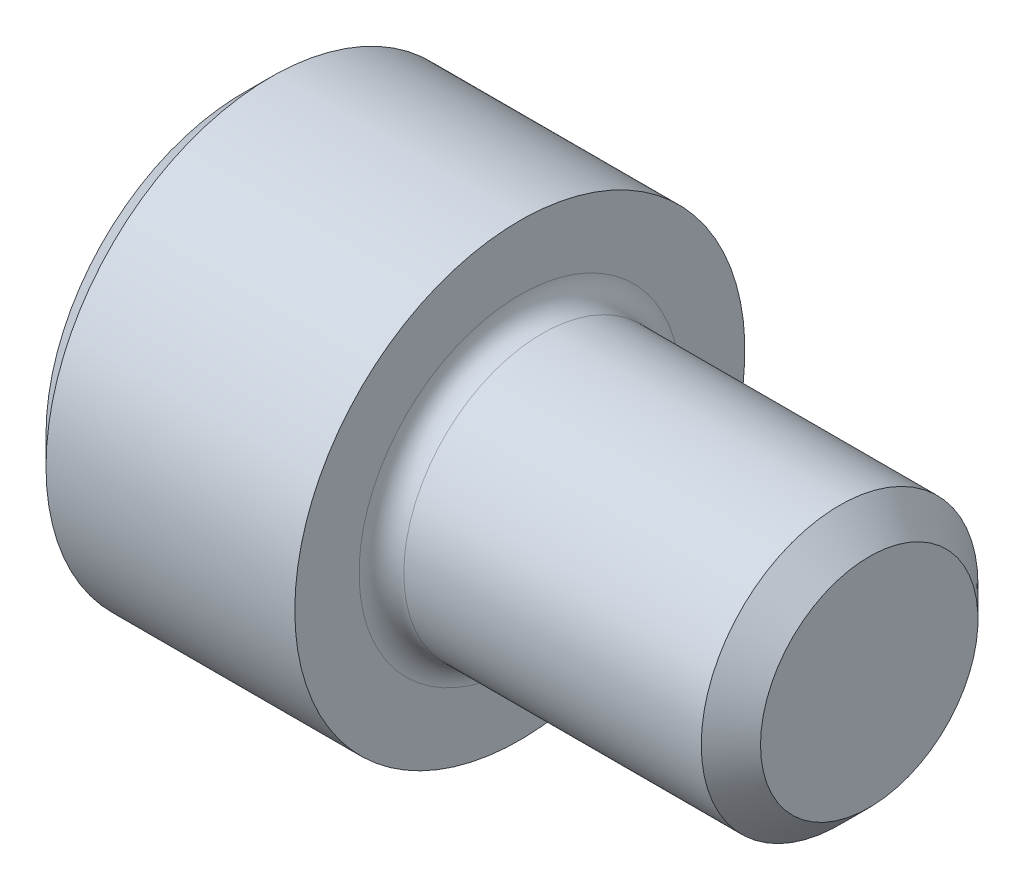
ISO-10303-21;
HEADER;
FILE_DESCRIPTION(('STEP AP214'),'2;1');
FILE_NAME('part.step','',(''),(''),'','','');
FILE_SCHEMA(('AUTOMOTIVE_DESIGN { 1 0 10303 214 1 1 1 1 }'));
ENDSEC;
DATA;
#1=APPLICATION_CONTEXT('core data for automotive mechanical design processes');
#2=APPLICATION_PROTOCOL_DEFINITION('international standard','automotive_design',2000,#1);
#3=PRODUCT_CONTEXT('',#1,'mechanical');
#4=PRODUCT('Part','Part','',(#3));
#5=PRODUCT_RELATED_PRODUCT_CATEGORY('part','',(#4));
#6=PRODUCT_DEFINITION_FORMATION('','',#4);
#7=PRODUCT_DEFINITION_CONTEXT('part definition',#1,'design');
#8=PRODUCT_DEFINITION('design','',#6,#7);
#9=PRODUCT_DEFINITION_SHAPE('','',#8);
#10=(LENGTH_UNIT() NAMED_UNIT(*) SI_UNIT(.MILLI.,.METRE.));
#11=(NAMED_UNIT(*) PLANE_ANGLE_UNIT() SI_UNIT($,.RADIAN.));
#12=(NAMED_UNIT(*) SI_UNIT($,.STERADIAN.) SOLID_ANGLE_UNIT());
#13=UNCERTAINTY_MEASURE_WITH_UNIT(LENGTH_MEASURE(1.E-05),#10,'distance_accuracy_value','');
#14=(GEOMETRIC_REPRESENTATION_CONTEXT(3) GLOBAL_UNCERTAINTY_ASSIGNED_CONTEXT((#13)) GLOBAL_UNIT_ASSIGNED_CONTEXT((#10,
#11,#12)) REPRESENTATION_CONTEXT('',''));
#15=CARTESIAN_POINT('',(0.,0.,0.));
#16=DIRECTION('',(0.,0.,1.));
#17=DIRECTION('',(1.,0.,0.));
#18=AXIS2_PLACEMENT_3D('',#15,#16,#17);
#19=CARTESIAN_POINT('',(0.,0.,0.));
#20=DIRECTION('',(-1.,0.,0.));
#21=DIRECTION('',(0.,0.,1.));
#22=AXIS2_PLACEMENT_3D('',#19,#20,#21);
#23=PLANE('',#22);
#24=DIRECTION('',(0.,-0.499999999999999,0.866025403784439));
#25=VECTOR('',#24,1.);
#26=CARTESIAN_POINT('',(0.,1.14384635331849,0.));
#27=LINE('',#26,#25);
#28=CARTESIAN_POINT('',(0.,1.14384635331849,0.));
#29=VERTEX_POINT('',#28);
#30=CARTESIAN_POINT('',(0.,0.571923176659249,0.990599999999998));
#31=VERTEX_POINT('',#30);
#32=EDGE_CURVE('E258',#29,#31,#27,.T.);
#33=ORIENTED_EDGE('',*,*,#32,.T.);
#34=DIRECTION('',(0.,1.,0.));
#35=VECTOR('',#34,1.);
#36=CARTESIAN_POINT('',(0.,-0.571923176659238,0.9906));
#37=LINE('',#36,#35);
#38=CARTESIAN_POINT('',(0.,-0.571923176659238,0.9906));
#39=VERTEX_POINT('',#38);
#40=EDGE_CURVE('E129',#39,#31,#37,.T.);
#41=ORIENTED_EDGE('',*,*,#40,.F.);
#42=DIRECTION('',(0.,-0.500000000000001,-0.866025403784438));
#43=VECTOR('',#42,1.);
#44=CARTESIAN_POINT('',(0.,-0.571923176659238,0.9906));
#45=LINE('',#44,#43);
#46=CARTESIAN_POINT('',(0.,-1.14384635331848,0.));
#47=VERTEX_POINT('',#46);
#48=EDGE_CURVE('E261',#39,#47,#45,.T.);
#49=ORIENTED_EDGE('',*,*,#48,.T.);
#50=DIRECTION('',(0.,0.499999999999999,-0.866025403784439));
#51=VECTOR('',#50,1.);
#52=CARTESIAN_POINT('',(0.,-1.14384635331848,0.));
#53=LINE('',#52,#51);
#54=CARTESIAN_POINT('',(0.,-0.57192317665924,-0.990600000000001));
#55=VERTEX_POINT('',#54);
#56=EDGE_CURVE('E264',#47,#55,#53,.T.);
#57=ORIENTED_EDGE('',*,*,#56,.T.);
#58=DIRECTION('',(0.,-1.,0.));
#59=VECTOR('',#58,1.);
#60=CARTESIAN_POINT('',(0.,0.571923176659246,-0.990600000000003));
#61=LINE('',#60,#59);
#62=CARTESIAN_POINT('',(0.,0.571923176659246,-0.990600000000003));
#63=VERTEX_POINT('',#62);
#64=EDGE_CURVE('E267',#63,#55,#61,.T.);
#65=ORIENTED_EDGE('',*,*,#64,.F.);
#66=DIRECTION('',(0.,-0.500000000000001,-0.866025403784438));
#67=VECTOR('',#66,1.);
#68=CARTESIAN_POINT('',(0.,1.14384635331849,0.));
#69=LINE('',#68,#67);
#70=EDGE_CURVE('E124',#29,#63,#69,.T.);
#71=ORIENTED_EDGE('',*,*,#70,.F.);
#72=EDGE_LOOP('',(#33,#41,#49,#57,#65,#71));
#73=FACE_BOUND('',#72,.T.);
#74=CARTESIAN_POINT('',(0.,0.,0.));
#75=DIRECTION('',(-1.,0.,0.));
#76=DIRECTION('',(0.,0.,1.));
#77=AXIS2_PLACEMENT_3D('',#74,#75,#76);
#78=CIRCLE('',#77,1.7907);
#79=CARTESIAN_POINT('',(0.,0.,1.7907));
#80=VERTEX_POINT('',#79);
#81=EDGE_CURVE('E153',#80,#80,#78,.T.);
#82=ORIENTED_EDGE('',*,*,#81,.T.);
#83=EDGE_LOOP('',(#82));
#84=FACE_BOUND('',#83,.T.);
#85=ADVANCED_FACE('F33',(#73,#84),#23,.T.);
#86=CARTESIAN_POINT('',(0.,0.,0.));
#87=DIRECTION('',(1.,0.,0.));
#88=DIRECTION('',(0.,0.,-1.));
#89=AXIS2_PLACEMENT_3D('',#86,#87,#88);
#90=CONICAL_SURFACE('',#89,1.7907,0.785398163397442);
#91=CARTESIAN_POINT('',(0.254000000000004,0.,0.));
#92=DIRECTION('',(-1.,0.,0.));
#93=DIRECTION('',(0.,0.,1.));
#94=AXIS2_PLACEMENT_3D('',#91,#92,#93);
#95=CIRCLE('',#94,2.0447);
#96=CARTESIAN_POINT('',(0.254000000000004,0.,2.0447));
#97=VERTEX_POINT('',#96);
#98=EDGE_CURVE('E150',#97,#97,#95,.T.);
#99=ORIENTED_EDGE('',*,*,#98,.T.);
#100=EDGE_LOOP('',(#99));
#101=FACE_BOUND('',#100,.T.);
#102=ORIENTED_EDGE('',*,*,#81,.F.);
#103=EDGE_LOOP('',(#102));
#104=FACE_BOUND('',#103,.T.);
#105=ADVANCED_FACE('F174',(#101,#104),#90,.T.);
#106=CARTESIAN_POINT('',(-31.75,0.,0.));
#107=DIRECTION('',(-1.,0.,0.));
#108=DIRECTION('',(0.,0.,1.));
#109=AXIS2_PLACEMENT_3D('',#106,#107,#108);
#110=CYLINDRICAL_SURFACE('',#109,2.0447);
#111=CARTESIAN_POINT('',(2.51460000000001,0.,0.));
#112=DIRECTION('',(-1.,0.,0.));
#113=DIRECTION('',(0.,0.,1.));
#114=AXIS2_PLACEMENT_3D('',#111,#112,#113);
#115=CIRCLE('',#114,2.0447);
#116=CARTESIAN_POINT('',(2.51460000000001,0.,2.0447));
#117=VERTEX_POINT('',#116);
#118=EDGE_CURVE('E147',#117,#117,#115,.T.);
#119=ORIENTED_EDGE('',*,*,#118,.T.);
#120=EDGE_LOOP('',(#119));
#121=FACE_BOUND('',#120,.T.);
#122=ORIENTED_EDGE('',*,*,#98,.F.);
#123=EDGE_LOOP('',(#122));
#124=FACE_BOUND('',#123,.T.);
#125=ADVANCED_FACE('F179',(#121,#124),#110,.T.);
#126=CARTESIAN_POINT('',(2.5146,2.0447,0.));
#127=DIRECTION('',(1.,0.,0.));
#128=DIRECTION('',(0.,0.,-1.));
#129=AXIS2_PLACEMENT_3D('',#126,#127,#128);
#130=PLANE('',#129);
#131=CARTESIAN_POINT('',(2.5146,0.,0.));
#132=DIRECTION('',(1.,0.,0.));
#133=DIRECTION('',(0.,0.,-1.));
#134=AXIS2_PLACEMENT_3D('',#131,#132,#133);
#135=CIRCLE('',#134,1.4605);
#136=CARTESIAN_POINT('',(2.5146,0.,-1.4605));
#137=VERTEX_POINT('',#136);
#138=EDGE_CURVE('E41',#137,#137,#135,.F.);
#139=ORIENTED_EDGE('',*,*,#138,.T.);
#140=EDGE_LOOP('',(#139));
#141=FACE_BOUND('',#140,.T.);
#142=ORIENTED_EDGE('',*,*,#118,.F.);
#143=EDGE_LOOP('',(#142));
#144=FACE_BOUND('',#143,.T.);
#145=ADVANCED_FACE('F158',(#141,#144),#130,.T.);
#146=CARTESIAN_POINT('',(-31.75,0.,0.));
#147=DIRECTION('',(-1.,0.,0.));
#148=DIRECTION('',(0.,0.,1.));
#149=AXIS2_PLACEMENT_3D('',#146,#147,#148);
#150=CYLINDRICAL_SURFACE('',#149,1.2573);
#151=CARTESIAN_POINT('',(2.7178,0.,0.));
#152=DIRECTION('',(1.,0.,0.));
#153=DIRECTION('',(0.,0.,-1.));
#154=AXIS2_PLACEMENT_3D('',#151,#152,#153);
#155=CIRCLE('',#154,1.2573);
#156=CARTESIAN_POINT('',(2.7178,0.,-1.2573));
#157=VERTEX_POINT('',#156);
#158=EDGE_CURVE('E11',#157,#157,#155,.T.);
#159=ORIENTED_EDGE('',*,*,#158,.T.);
#160=EDGE_LOOP('',(#159));
#161=FACE_BOUND('',#160,.T.);
#162=CARTESIAN_POINT('',(5.42036000000001,0.,0.));
#163=DIRECTION('',(-1.,0.,0.));
#164=DIRECTION('',(0.,0.,1.));
#165=AXIS2_PLACEMENT_3D('',#162,#163,#164);
#166=CIRCLE('',#165,1.2573);
#167=CARTESIAN_POINT('',(5.42036000000001,0.,1.2573));
#168=VERTEX_POINT('',#167);
#169=EDGE_CURVE('E144',#168,#168,#166,.T.);
#170=ORIENTED_EDGE('',*,*,#169,.T.);
#171=EDGE_LOOP('',(#170));
#172=FACE_BOUND('',#171,.T.);
#173=ADVANCED_FACE('F189',(#161,#172),#150,.T.);
#174=CARTESIAN_POINT('',(5.6896,0.,0.));
#175=DIRECTION('',(-1.,0.,0.));
#176=DIRECTION('',(0.,0.,1.));
#177=AXIS2_PLACEMENT_3D('',#174,#175,#176);
#178=CONICAL_SURFACE('',#177,0.988059999999999,0.785398163397468);
#179=ORIENTED_EDGE('',*,*,#169,.F.);
#180=EDGE_LOOP('',(#179));
#181=FACE_BOUND('',#180,.T.);
#182=CARTESIAN_POINT('',(5.6896,0.,0.));
#183=DIRECTION('',(-1.,0.,0.));
#184=DIRECTION('',(0.,0.,1.));
#185=AXIS2_PLACEMENT_3D('',#182,#183,#184);
#186=CIRCLE('',#185,0.988059999999999);
#187=CARTESIAN_POINT('',(5.6896,0.,0.988059999999999));
#188=VERTEX_POINT('',#187);
#189=EDGE_CURVE('E140',#188,#188,#186,.T.);
#190=ORIENTED_EDGE('',*,*,#189,.T.);
#191=EDGE_LOOP('',(#190));
#192=FACE_BOUND('',#191,.T.);
#193=ADVANCED_FACE('F169',(#181,#192),#178,.T.);
#194=CARTESIAN_POINT('',(5.6896,0.988059999999999,0.));
#195=DIRECTION('',(1.,0.,0.));
#196=DIRECTION('',(0.,0.,-1.));
#197=AXIS2_PLACEMENT_3D('',#194,#195,#196);
#198=PLANE('',#197);
#199=ORIENTED_EDGE('',*,*,#189,.F.);
#200=EDGE_LOOP('',(#199));
#201=FACE_BOUND('',#200,.T.);
#202=ADVANCED_FACE('F162',(#201),#198,.T.);
#203=CARTESIAN_POINT('',(2.7178,0.,0.));
#204=DIRECTION('',(1.,0.,0.));
#205=DIRECTION('',(0.,0.,-1.));
#206=AXIS2_PLACEMENT_3D('',#203,#204,#205);
#207=TOROIDAL_SURFACE('',#206,1.4605,0.2032);
#208=ORIENTED_EDGE('',*,*,#158,.F.);
#209=EDGE_LOOP('',(#208));
#210=FACE_BOUND('',#209,.T.);
#211=ORIENTED_EDGE('',*,*,#138,.F.);
#212=EDGE_LOOP('',(#211));
#213=FACE_BOUND('',#212,.T.);
#214=ADVANCED_FACE('F35',(#210,#213),#207,.F.);
#215=CARTESIAN_POINT('',(1.1176,1.14384635331849,0.));
#216=DIRECTION('',(0.,-0.866025403784439,-0.499999999999999));
#217=DIRECTION('',(0.,0.499999999999999,-0.866025403784439));
#218=AXIS2_PLACEMENT_3D('',#215,#216,#217);
#219=PLANE('',#218);
#220=ORIENTED_EDGE('',*,*,#32,.F.);
#221=DIRECTION('',(-1.,0.,0.));
#222=VECTOR('',#221,1.);
#223=CARTESIAN_POINT('',(1.1176,1.14384635331849,0.));
#224=LINE('',#223,#222);
#225=CARTESIAN_POINT('',(1.1176,1.14384635331849,0.));
#226=VERTEX_POINT('',#225);
#227=EDGE_CURVE('E248',#226,#29,#224,.T.);
#228=ORIENTED_EDGE('',*,*,#227,.F.);
#229=DIRECTION('',(0.,-0.499999999999999,0.866025403784439));
#230=VECTOR('',#229,1.);
#231=CARTESIAN_POINT('',(1.1176,1.14384635331849,0.));
#232=LINE('',#231,#230);
#233=CARTESIAN_POINT('',(1.1176,0.857884764988869,0.4953));
#234=VERTEX_POINT('',#233);
#235=EDGE_CURVE('E116',#226,#234,#232,.T.);
#236=ORIENTED_EDGE('',*,*,#235,.T.);
#237=CARTESIAN_POINT('',(1.1176,0.571923176659249,0.990599999999998));
#238=VERTEX_POINT('',#237);
#239=EDGE_CURVE('E107',#234,#238,#232,.T.);
#240=ORIENTED_EDGE('',*,*,#239,.T.);
#241=DIRECTION('',(-1.,0.,0.));
#242=VECTOR('',#241,1.);
#243=CARTESIAN_POINT('',(1.1176,0.571923176659249,0.990599999999998));
#244=LINE('',#243,#242);
#245=EDGE_CURVE('E121',#238,#31,#244,.T.);
#246=ORIENTED_EDGE('',*,*,#245,.T.);
#247=EDGE_LOOP('',(#220,#228,#236,#240,#246));
#248=FACE_BOUND('',#247,.T.);
#249=ADVANCED_FACE('F120',(#248),#219,.T.);
#250=CARTESIAN_POINT('',(1.1176,-0.571923176659238,0.9906));
#251=DIRECTION('',(0.,0.,1.));
#252=DIRECTION('',(0.,-1.,0.));
#253=AXIS2_PLACEMENT_3D('',#250,#251,#252);
#254=PLANE('',#253);
#255=ORIENTED_EDGE('',*,*,#40,.T.);
#256=ORIENTED_EDGE('',*,*,#245,.F.);
#257=DIRECTION('',(0.,1.,0.));
#258=VECTOR('',#257,1.);
#259=CARTESIAN_POINT('',(1.1176,-0.571923176659238,0.9906));
#260=LINE('',#259,#258);
#261=CARTESIAN_POINT('',(1.1176,0.,0.990599999999999));
#262=VERTEX_POINT('',#261);
#263=EDGE_CURVE('E104',#262,#238,#260,.T.);
#264=ORIENTED_EDGE('',*,*,#263,.F.);
#265=CARTESIAN_POINT('',(1.1176,-0.571923176659238,0.9906));
#266=VERTEX_POINT('',#265);
#267=EDGE_CURVE('E115',#266,#262,#260,.T.);
#268=ORIENTED_EDGE('',*,*,#267,.F.);
#269=DIRECTION('',(-1.,0.,0.));
#270=VECTOR('',#269,1.);
#271=CARTESIAN_POINT('',(1.1176,-0.571923176659238,0.9906));
#272=LINE('',#271,#270);
#273=EDGE_CURVE('E131',#266,#39,#272,.T.);
#274=ORIENTED_EDGE('',*,*,#273,.T.);
#275=EDGE_LOOP('',(#255,#256,#264,#268,#274));
#276=FACE_BOUND('',#275,.T.);
#277=ADVANCED_FACE('F126',(#276),#254,.F.);
#278=CARTESIAN_POINT('',(1.1176,-0.571923176659238,0.9906));
#279=DIRECTION('',(0.,0.866025403784438,-0.500000000000001));
#280=DIRECTION('',(0.,0.500000000000001,0.866025403784438));
#281=AXIS2_PLACEMENT_3D('',#278,#279,#280);
#282=PLANE('',#281);
#283=ORIENTED_EDGE('',*,*,#48,.F.);
#284=ORIENTED_EDGE('',*,*,#273,.F.);
#285=DIRECTION('',(0.,-0.500000000000001,-0.866025403784438));
#286=VECTOR('',#285,1.);
#287=CARTESIAN_POINT('',(1.1176,-0.571923176659238,0.9906));
#288=LINE('',#287,#286);
#289=CARTESIAN_POINT('',(1.1176,-0.857884764988861,0.495299999999999));
#290=VERTEX_POINT('',#289);
#291=EDGE_CURVE('E287',#266,#290,#288,.T.);
#292=ORIENTED_EDGE('',*,*,#291,.T.);
#293=CARTESIAN_POINT('',(1.1176,-1.14384635331848,0.));
#294=VERTEX_POINT('',#293);
#295=EDGE_CURVE('E276',#290,#294,#288,.T.);
#296=ORIENTED_EDGE('',*,*,#295,.T.);
#297=DIRECTION('',(-1.,0.,0.));
#298=VECTOR('',#297,1.);
#299=CARTESIAN_POINT('',(1.1176,-1.14384635331848,0.));
#300=LINE('',#299,#298);
#301=EDGE_CURVE('E136',#294,#47,#300,.T.);
#302=ORIENTED_EDGE('',*,*,#301,.T.);
#303=EDGE_LOOP('',(#283,#284,#292,#296,#302));
#304=FACE_BOUND('',#303,.T.);
#305=ADVANCED_FACE('F202',(#304),#282,.T.);
#306=CARTESIAN_POINT('',(1.1176,-1.14384635331848,0.));
#307=DIRECTION('',(0.,0.866025403784439,0.499999999999999));
#308=DIRECTION('',(0.,-0.499999999999999,0.866025403784439));
#309=AXIS2_PLACEMENT_3D('',#306,#307,#308);
#310=PLANE('',#309);
#311=ORIENTED_EDGE('',*,*,#56,.F.);
#312=ORIENTED_EDGE('',*,*,#301,.F.);
#313=DIRECTION('',(0.,0.499999999999999,-0.866025403784439));
#314=VECTOR('',#313,1.);
#315=CARTESIAN_POINT('',(1.1176,-1.14384635331848,0.));
#316=LINE('',#315,#314);
#317=CARTESIAN_POINT('',(1.1176,-0.857884764988863,-0.495299999999997));
#318=VERTEX_POINT('',#317);
#319=EDGE_CURVE('E254',#294,#318,#316,.T.);
#320=ORIENTED_EDGE('',*,*,#319,.T.);
#321=CARTESIAN_POINT('',(1.1176,-0.57192317665924,-0.990600000000001));
#322=VERTEX_POINT('',#321);
#323=EDGE_CURVE('E286',#318,#322,#316,.T.);
#324=ORIENTED_EDGE('',*,*,#323,.T.);
#325=DIRECTION('',(-1.,0.,0.));
#326=VECTOR('',#325,1.);
#327=CARTESIAN_POINT('',(1.1176,-0.57192317665924,-0.990600000000001));
#328=LINE('',#327,#326);
#329=EDGE_CURVE('E247',#322,#55,#328,.T.);
#330=ORIENTED_EDGE('',*,*,#329,.T.);
#331=EDGE_LOOP('',(#311,#312,#320,#324,#330));
#332=FACE_BOUND('',#331,.T.);
#333=ADVANCED_FACE('F205',(#332),#310,.T.);
#334=CARTESIAN_POINT('',(1.1176,0.571923176659246,-0.990600000000003));
#335=DIRECTION('',(0.,0.,-1.));
#336=DIRECTION('',(0.,1.,0.));
#337=AXIS2_PLACEMENT_3D('',#334,#335,#336);
#338=PLANE('',#337);
#339=ORIENTED_EDGE('',*,*,#64,.T.);
#340=ORIENTED_EDGE('',*,*,#329,.F.);
#341=DIRECTION('',(0.,-1.,0.));
#342=VECTOR('',#341,1.);
#343=CARTESIAN_POINT('',(1.1176,0.571923176659246,-0.990600000000003));
#344=LINE('',#343,#342);
#345=CARTESIAN_POINT('',(1.11760000000001,0.,-0.990600000000001));
#346=VERTEX_POINT('',#345);
#347=EDGE_CURVE('E251',#346,#322,#344,.T.);
#348=ORIENTED_EDGE('',*,*,#347,.F.);
#349=CARTESIAN_POINT('',(1.1176,0.571923176659246,-0.990600000000003));
#350=VERTEX_POINT('',#349);
#351=EDGE_CURVE('E48',#350,#346,#344,.T.);
#352=ORIENTED_EDGE('',*,*,#351,.F.);
#353=DIRECTION('',(-1.,0.,0.));
#354=VECTOR('',#353,1.);
#355=CARTESIAN_POINT('',(1.1176,0.571923176659246,-0.990600000000003));
#356=LINE('',#355,#354);
#357=EDGE_CURVE('E244',#350,#63,#356,.T.);
#358=ORIENTED_EDGE('',*,*,#357,.T.);
#359=EDGE_LOOP('',(#339,#340,#348,#352,#358));
#360=FACE_BOUND('',#359,.T.);
#361=ADVANCED_FACE('F209',(#360),#338,.F.);
#362=CARTESIAN_POINT('',(1.1176,1.14384635331849,0.));
#363=DIRECTION('',(0.,0.866025403784438,-0.500000000000001));
#364=DIRECTION('',(0.,0.500000000000001,0.866025403784438));
#365=AXIS2_PLACEMENT_3D('',#362,#363,#364);
#366=PLANE('',#365);
#367=ORIENTED_EDGE('',*,*,#70,.T.);
#368=ORIENTED_EDGE('',*,*,#357,.F.);
#369=DIRECTION('',(0.,-0.500000000000001,-0.866025403784438));
#370=VECTOR('',#369,1.);
#371=CARTESIAN_POINT('',(1.1176,1.14384635331849,0.));
#372=LINE('',#371,#370);
#373=CARTESIAN_POINT('',(1.1176,0.857884764988868,-0.495300000000004));
#374=VERTEX_POINT('',#373);
#375=EDGE_CURVE('E234',#374,#350,#372,.T.);
#376=ORIENTED_EDGE('',*,*,#375,.F.);
#377=EDGE_CURVE('E240',#226,#374,#372,.T.);
#378=ORIENTED_EDGE('',*,*,#377,.F.);
#379=ORIENTED_EDGE('',*,*,#227,.T.);
#380=EDGE_LOOP('',(#367,#368,#376,#378,#379));
#381=FACE_BOUND('',#380,.T.);
#382=ADVANCED_FACE('F213',(#381),#366,.F.);
#383=CARTESIAN_POINT('',(1.1176,1.71576952997773,-0.990600000000004));
#384=DIRECTION('',(1.,0.,0.));
#385=DIRECTION('',(0.,0.,-1.));
#386=AXIS2_PLACEMENT_3D('',#383,#384,#385);
#387=PLANE('',#386);
#388=ORIENTED_EDGE('',*,*,#347,.T.);
#389=ORIENTED_EDGE('',*,*,#323,.F.);
#390=CARTESIAN_POINT('',(1.11760000000001,0.,0.));
#391=DIRECTION('',(-1.,0.,0.));
#392=DIRECTION('',(0.,0.,1.));
#393=AXIS2_PLACEMENT_3D('',#390,#391,#392);
#394=CIRCLE('',#393,0.990600000000001);
#395=EDGE_CURVE('E282',#346,#318,#394,.T.);
#396=ORIENTED_EDGE('',*,*,#395,.F.);
#397=EDGE_LOOP('',(#388,#389,#396));
#398=FACE_BOUND('',#397,.T.);
#399=ADVANCED_FACE('F217',(#398),#387,.F.);
#400=ORIENTED_EDGE('',*,*,#319,.F.);
#401=ORIENTED_EDGE('',*,*,#295,.F.);
#402=EDGE_CURVE('E134',#318,#290,#394,.T.);
#403=ORIENTED_EDGE('',*,*,#402,.F.);
#404=EDGE_LOOP('',(#400,#401,#403));
#405=FACE_BOUND('',#404,.T.);
#406=ADVANCED_FACE('F220',(#405),#387,.F.);
#407=ORIENTED_EDGE('',*,*,#291,.F.);
#408=ORIENTED_EDGE('',*,*,#267,.T.);
#409=EDGE_CURVE('E130',#290,#262,#394,.T.);
#410=ORIENTED_EDGE('',*,*,#409,.F.);
#411=EDGE_LOOP('',(#407,#408,#410));
#412=FACE_BOUND('',#411,.T.);
#413=ADVANCED_FACE('F225',(#412),#387,.F.);
#414=ORIENTED_EDGE('',*,*,#263,.T.);
#415=ORIENTED_EDGE('',*,*,#239,.F.);
#416=EDGE_CURVE('E110',#262,#234,#394,.T.);
#417=ORIENTED_EDGE('',*,*,#416,.F.);
#418=EDGE_LOOP('',(#414,#415,#417));
#419=FACE_BOUND('',#418,.T.);
#420=ADVANCED_FACE('F106',(#419),#387,.F.);
#421=ORIENTED_EDGE('',*,*,#235,.F.);
#422=ORIENTED_EDGE('',*,*,#377,.T.);
#423=EDGE_CURVE('E141',#234,#374,#394,.T.);
#424=ORIENTED_EDGE('',*,*,#423,.F.);
#425=EDGE_LOOP('',(#421,#422,#424));
#426=FACE_BOUND('',#425,.T.);
#427=ADVANCED_FACE('F228',(#426),#387,.F.);
#428=ORIENTED_EDGE('',*,*,#375,.T.);
#429=ORIENTED_EDGE('',*,*,#351,.T.);
#430=EDGE_CURVE('E237',#374,#346,#394,.T.);
#431=ORIENTED_EDGE('',*,*,#430,.F.);
#432=EDGE_LOOP('',(#428,#429,#431));
#433=FACE_BOUND('',#432,.T.);
#434=ADVANCED_FACE('F198',(#433),#387,.F.);
#435=CARTESIAN_POINT('',(1.11760000000001,0.,0.));
#436=DIRECTION('',(-1.,0.,0.));
#437=DIRECTION('',(0.,0.,1.));
#438=AXIS2_PLACEMENT_3D('',#435,#436,#437);
#439=CONICAL_SURFACE('',#438,0.990600000000001,1.04719755119659);
#440=CARTESIAN_POINT('',(1.68952317665926,0.,0.));
#441=VERTEX_POINT('',#440);
#442=VERTEX_LOOP('',#441);
#443=FACE_BOUND('',#442,.T.);
#444=ORIENTED_EDGE('',*,*,#416,.T.);
#445=ORIENTED_EDGE('',*,*,#423,.T.);
#446=ORIENTED_EDGE('',*,*,#430,.T.);
#447=ORIENTED_EDGE('',*,*,#395,.T.);
#448=ORIENTED_EDGE('',*,*,#402,.T.);
#449=ORIENTED_EDGE('',*,*,#409,.T.);
#450=EDGE_LOOP('',(#444,#445,#446,#447,#448,#449));
#451=FACE_BOUND('',#450,.T.);
#452=ADVANCED_FACE('F196',(#443,#451),#439,.F.);
#453=CLOSED_SHELL('',(#85,#105,#125,#145,#173,#193,#202,#214,#249,#277,#305,#333,#361,#382,#399,
#406,#413,#420,#427,#434,#452));
#454=MANIFOLD_SOLID_BREP('B2',#453);
#455=ADVANCED_BREP_SHAPE_REPRESENTATION('',(#18,#454),#14);
#456=SHAPE_DEFINITION_REPRESENTATION(#9,#455);
ENDSEC;
END-ISO-10303-21;
